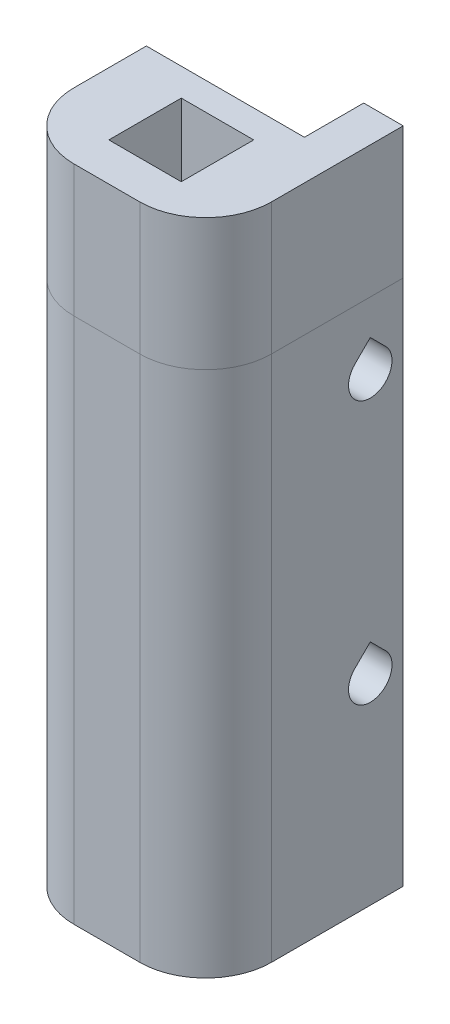
ISO-10303-21;
HEADER;
FILE_DESCRIPTION(('STEP AP214'),'2;1');
FILE_NAME('part.step','',(''),(''),'','','');
FILE_SCHEMA(('AUTOMOTIVE_DESIGN { 1 0 10303 214 1 1 1 1 }'));
ENDSEC;
DATA;
#1=APPLICATION_CONTEXT('core data for automotive mechanical design processes');
#2=APPLICATION_PROTOCOL_DEFINITION('international standard','automotive_design',2000,#1);
#3=PRODUCT_CONTEXT('',#1,'mechanical');
#4=PRODUCT('Part','Part','',(#3));
#5=PRODUCT_RELATED_PRODUCT_CATEGORY('part','',(#4));
#6=PRODUCT_DEFINITION_FORMATION('','',#4);
#7=PRODUCT_DEFINITION_CONTEXT('part definition',#1,'design');
#8=PRODUCT_DEFINITION('design','',#6,#7);
#9=PRODUCT_DEFINITION_SHAPE('','',#8);
#10=(LENGTH_UNIT() NAMED_UNIT(*) SI_UNIT(.MILLI.,.METRE.));
#11=(NAMED_UNIT(*) PLANE_ANGLE_UNIT() SI_UNIT($,.RADIAN.));
#12=(NAMED_UNIT(*) SI_UNIT($,.STERADIAN.) SOLID_ANGLE_UNIT());
#13=UNCERTAINTY_MEASURE_WITH_UNIT(LENGTH_MEASURE(1.E-05),#10,'distance_accuracy_value','');
#14=(GEOMETRIC_REPRESENTATION_CONTEXT(3) GLOBAL_UNCERTAINTY_ASSIGNED_CONTEXT((#13)) GLOBAL_UNIT_ASSIGNED_CONTEXT((#10,
#11,#12)) REPRESENTATION_CONTEXT('',''));
#15=CARTESIAN_POINT('',(0.,0.,0.));
#16=DIRECTION('',(0.,0.,1.));
#17=DIRECTION('',(1.,0.,0.));
#18=AXIS2_PLACEMENT_3D('',#15,#16,#17);
#19=CARTESIAN_POINT('',(-7.5,15.,-0.00999999999999959));
#20=DIRECTION('',(0.,-1.,0.));
#21=DIRECTION('',(0.,0.,-1.));
#22=AXIS2_PLACEMENT_3D('',#19,#20,#21);
#23=PLANE('',#22);
#24=DIRECTION('',(0.,0.,1.));
#25=VECTOR('',#24,1.);
#26=CARTESIAN_POINT('',(-7.5,15.,15.));
#27=LINE('',#26,#25);
#28=CARTESIAN_POINT('',(-7.5,15.,4.5));
#29=VERTEX_POINT('',#28);
#30=CARTESIAN_POINT('',(-7.5,15.,10.));
#31=VERTEX_POINT('',#30);
#32=EDGE_CURVE('E142',#29,#31,#27,.T.);
#33=ORIENTED_EDGE('',*,*,#32,.F.);
#34=DIRECTION('',(-1.,0.,0.));
#35=VECTOR('',#34,1.);
#36=CARTESIAN_POINT('',(0.,15.,4.5));
#37=LINE('',#36,#35);
#38=CARTESIAN_POINT('',(4.5,15.,4.5));
#39=VERTEX_POINT('',#38);
#40=EDGE_CURVE('E137',#39,#29,#37,.T.);
#41=ORIENTED_EDGE('',*,*,#40,.F.);
#42=DIRECTION('',(0.,0.,1.));
#43=VECTOR('',#42,1.);
#44=CARTESIAN_POINT('',(4.5,15.,0.));
#45=LINE('',#44,#43);
#46=CARTESIAN_POINT('',(4.5,15.,0.));
#47=VERTEX_POINT('',#46);
#48=EDGE_CURVE('E140',#47,#39,#45,.T.);
#49=ORIENTED_EDGE('',*,*,#48,.F.);
#50=DIRECTION('',(-1.,0.,0.));
#51=VECTOR('',#50,1.);
#52=CARTESIAN_POINT('',(0.,15.,0.));
#53=LINE('',#52,#51);
#54=CARTESIAN_POINT('',(7.5,15.,0.));
#55=VERTEX_POINT('',#54);
#56=EDGE_CURVE('E145',#55,#47,#53,.T.);
#57=ORIENTED_EDGE('',*,*,#56,.F.);
#58=DIRECTION('',(0.,0.,1.));
#59=VECTOR('',#58,1.);
#60=CARTESIAN_POINT('',(7.5,15.,15.));
#61=LINE('',#60,#59);
#62=CARTESIAN_POINT('',(7.5,15.,10.));
#63=VERTEX_POINT('',#62);
#64=EDGE_CURVE('E148',#55,#63,#61,.T.);
#65=ORIENTED_EDGE('',*,*,#64,.T.);
#66=CARTESIAN_POINT('',(2.5,15.,10.));
#67=DIRECTION('',(0.,-1.,0.));
#68=DIRECTION('',(0.,0.,-1.));
#69=AXIS2_PLACEMENT_3D('',#66,#67,#68);
#70=CIRCLE('',#69,5.);
#71=CARTESIAN_POINT('',(2.5,15.,15.));
#72=VERTEX_POINT('',#71);
#73=EDGE_CURVE('E129',#72,#63,#70,.F.);
#74=ORIENTED_EDGE('',*,*,#73,.F.);
#75=DIRECTION('',(-1.,0.,0.));
#76=VECTOR('',#75,1.);
#77=CARTESIAN_POINT('',(0.,15.,15.));
#78=LINE('',#77,#76);
#79=CARTESIAN_POINT('',(-2.5,15.,15.));
#80=VERTEX_POINT('',#79);
#81=EDGE_CURVE('E151',#72,#80,#78,.T.);
#82=ORIENTED_EDGE('',*,*,#81,.T.);
#83=CARTESIAN_POINT('',(-2.5,15.,10.));
#84=DIRECTION('',(0.,-1.,0.));
#85=DIRECTION('',(0.,0.,-1.));
#86=AXIS2_PLACEMENT_3D('',#83,#84,#85);
#87=CIRCLE('',#86,5.);
#88=EDGE_CURVE('E125',#31,#80,#87,.F.);
#89=ORIENTED_EDGE('',*,*,#88,.F.);
#90=EDGE_LOOP('',(#33,#41,#49,#57,#65,#74,#82,#89));
#91=FACE_BOUND('',#90,.T.);
#92=DIRECTION('',(0.,0.,-1.));
#93=VECTOR('',#92,1.);
#94=CARTESIAN_POINT('',(-2.75,15.,0.));
#95=LINE('',#94,#93);
#96=CARTESIAN_POINT('',(-2.75,15.,12.1));
#97=VERTEX_POINT('',#96);
#98=CARTESIAN_POINT('',(-2.75,15.,6.6));
#99=VERTEX_POINT('',#98);
#100=EDGE_CURVE('E134',#97,#99,#95,.T.);
#101=ORIENTED_EDGE('',*,*,#100,.F.);
#102=DIRECTION('',(-1.,0.,0.));
#103=VECTOR('',#102,1.);
#104=CARTESIAN_POINT('',(0.,15.,12.1));
#105=LINE('',#104,#103);
#106=CARTESIAN_POINT('',(2.75,15.,12.1));
#107=VERTEX_POINT('',#106);
#108=EDGE_CURVE('E132',#107,#97,#105,.T.);
#109=ORIENTED_EDGE('',*,*,#108,.F.);
#110=DIRECTION('',(0.,0.,-1.));
#111=VECTOR('',#110,1.);
#112=CARTESIAN_POINT('',(2.75,15.,0.));
#113=LINE('',#112,#111);
#114=CARTESIAN_POINT('',(2.75,15.,6.6));
#115=VERTEX_POINT('',#114);
#116=EDGE_CURVE('E102',#107,#115,#113,.T.);
#117=ORIENTED_EDGE('',*,*,#116,.T.);
#118=DIRECTION('',(-1.,0.,0.));
#119=VECTOR('',#118,1.);
#120=CARTESIAN_POINT('',(0.,15.,6.6));
#121=LINE('',#120,#119);
#122=EDGE_CURVE('E154',#115,#99,#121,.T.);
#123=ORIENTED_EDGE('',*,*,#122,.T.);
#124=EDGE_LOOP('',(#101,#109,#117,#123));
#125=FACE_BOUND('',#124,.T.);
#126=ADVANCED_FACE('F55',(#91,#125),#23,.T.);
#127=CARTESIAN_POINT('',(0.,0.,0.));
#128=DIRECTION('',(0.,0.,-1.));
#129=DIRECTION('',(-1.,0.,0.));
#130=AXIS2_PLACEMENT_3D('',#127,#128,#129);
#131=PLANE('',#130);
#132=DIRECTION('',(0.,1.,0.));
#133=VECTOR('',#132,1.);
#134=CARTESIAN_POINT('',(7.5,-25.,0.));
#135=LINE('',#134,#133);
#136=CARTESIAN_POINT('',(7.5,25.,0.));
#137=VERTEX_POINT('',#136);
#138=EDGE_CURVE('E173',#55,#137,#135,.T.);
#139=ORIENTED_EDGE('',*,*,#138,.F.);
#140=ORIENTED_EDGE('',*,*,#56,.T.);
#141=DIRECTION('',(0.,1.,0.));
#142=VECTOR('',#141,1.);
#143=CARTESIAN_POINT('',(4.5,-25.,0.));
#144=LINE('',#143,#142);
#145=CARTESIAN_POINT('',(4.5,25.,0.));
#146=VERTEX_POINT('',#145);
#147=EDGE_CURVE('E124',#47,#146,#144,.T.);
#148=ORIENTED_EDGE('',*,*,#147,.T.);
#149=DIRECTION('',(-1.,0.,0.));
#150=VECTOR('',#149,1.);
#151=CARTESIAN_POINT('',(7.5,25.,0.));
#152=LINE('',#151,#150);
#153=EDGE_CURVE('E176',#137,#146,#152,.T.);
#154=ORIENTED_EDGE('',*,*,#153,.F.);
#155=EDGE_LOOP('',(#139,#140,#148,#154));
#156=FACE_BOUND('',#155,.T.);
#157=ADVANCED_FACE('F236',(#156),#131,.T.);
#158=CARTESIAN_POINT('',(4.5,-25.,0.));
#159=DIRECTION('',(-1.,0.,0.));
#160=DIRECTION('',(0.,0.,1.));
#161=AXIS2_PLACEMENT_3D('',#158,#159,#160);
#162=PLANE('',#161);
#163=ORIENTED_EDGE('',*,*,#147,.F.);
#164=ORIENTED_EDGE('',*,*,#48,.T.);
#165=DIRECTION('',(0.,1.,0.));
#166=VECTOR('',#165,1.);
#167=CARTESIAN_POINT('',(4.5,-25.,4.5));
#168=LINE('',#167,#166);
#169=CARTESIAN_POINT('',(4.5,25.,4.5));
#170=VERTEX_POINT('',#169);
#171=EDGE_CURVE('E59',#39,#170,#168,.T.);
#172=ORIENTED_EDGE('',*,*,#171,.T.);
#173=DIRECTION('',(0.,0.,1.));
#174=VECTOR('',#173,1.);
#175=CARTESIAN_POINT('',(4.5,25.,0.));
#176=LINE('',#175,#174);
#177=EDGE_CURVE('E65',#146,#170,#176,.T.);
#178=ORIENTED_EDGE('',*,*,#177,.F.);
#179=EDGE_LOOP('',(#163,#164,#172,#178));
#180=FACE_BOUND('',#179,.T.);
#181=ADVANCED_FACE('F238',(#180),#162,.T.);
#182=CARTESIAN_POINT('',(0.,-25.,4.5));
#183=DIRECTION('',(0.,0.,-1.));
#184=DIRECTION('',(-1.,0.,0.));
#185=AXIS2_PLACEMENT_3D('',#182,#183,#184);
#186=PLANE('',#185);
#187=ORIENTED_EDGE('',*,*,#171,.F.);
#188=ORIENTED_EDGE('',*,*,#40,.T.);
#189=DIRECTION('',(0.,1.,0.));
#190=VECTOR('',#189,1.);
#191=CARTESIAN_POINT('',(-7.5,-25.,4.5));
#192=LINE('',#191,#190);
#193=CARTESIAN_POINT('',(-7.5,25.,4.5));
#194=VERTEX_POINT('',#193);
#195=EDGE_CURVE('E158',#29,#194,#192,.T.);
#196=ORIENTED_EDGE('',*,*,#195,.T.);
#197=DIRECTION('',(-1.,0.,0.));
#198=VECTOR('',#197,1.);
#199=CARTESIAN_POINT('',(0.,25.,4.5));
#200=LINE('',#199,#198);
#201=EDGE_CURVE('E12',#170,#194,#200,.T.);
#202=ORIENTED_EDGE('',*,*,#201,.F.);
#203=EDGE_LOOP('',(#187,#188,#196,#202));
#204=FACE_BOUND('',#203,.T.);
#205=ADVANCED_FACE('F205',(#204),#186,.T.);
#206=CARTESIAN_POINT('',(0.,-25.,6.6));
#207=DIRECTION('',(0.,0.,-1.));
#208=DIRECTION('',(-1.,0.,0.));
#209=AXIS2_PLACEMENT_3D('',#206,#207,#208);
#210=PLANE('',#209);
#211=ORIENTED_EDGE('',*,*,#122,.F.);
#212=DIRECTION('',(0.,1.,0.));
#213=VECTOR('',#212,1.);
#214=CARTESIAN_POINT('',(2.75,-25.,6.6));
#215=LINE('',#214,#213);
#216=CARTESIAN_POINT('',(2.75,25.,6.6));
#217=VERTEX_POINT('',#216);
#218=EDGE_CURVE('E88',#115,#217,#215,.T.);
#219=ORIENTED_EDGE('',*,*,#218,.T.);
#220=DIRECTION('',(-1.,0.,0.));
#221=VECTOR('',#220,1.);
#222=CARTESIAN_POINT('',(0.,25.,6.6));
#223=LINE('',#222,#221);
#224=CARTESIAN_POINT('',(-2.75,25.,6.6));
#225=VERTEX_POINT('',#224);
#226=EDGE_CURVE('E119',#217,#225,#223,.T.);
#227=ORIENTED_EDGE('',*,*,#226,.T.);
#228=DIRECTION('',(0.,1.,0.));
#229=VECTOR('',#228,1.);
#230=CARTESIAN_POINT('',(-2.75,-25.,6.6));
#231=LINE('',#230,#229);
#232=EDGE_CURVE('E178',#99,#225,#231,.T.);
#233=ORIENTED_EDGE('',*,*,#232,.F.);
#234=EDGE_LOOP('',(#211,#219,#227,#233));
#235=FACE_BOUND('',#234,.T.);
#236=ADVANCED_FACE('F251',(#235),#210,.F.);
#237=CARTESIAN_POINT('',(7.5,-25.,15.));
#238=DIRECTION('',(-1.,0.,0.));
#239=DIRECTION('',(0.,0.,1.));
#240=AXIS2_PLACEMENT_3D('',#237,#238,#239);
#241=PLANE('',#240);
#242=ORIENTED_EDGE('',*,*,#64,.F.);
#243=ORIENTED_EDGE('',*,*,#138,.T.);
#244=DIRECTION('',(0.,0.,-1.));
#245=VECTOR('',#244,1.);
#246=CARTESIAN_POINT('',(7.5,25.,15.));
#247=LINE('',#246,#245);
#248=CARTESIAN_POINT('',(7.5,25.,10.));
#249=VERTEX_POINT('',#248);
#250=EDGE_CURVE('E172',#249,#137,#247,.T.);
#251=ORIENTED_EDGE('',*,*,#250,.F.);
#252=DIRECTION('',(0.,1.,0.));
#253=VECTOR('',#252,1.);
#254=CARTESIAN_POINT('',(7.5,-25.,10.));
#255=LINE('',#254,#253);
#256=EDGE_CURVE('E161',#249,#63,#255,.F.);
#257=ORIENTED_EDGE('',*,*,#256,.T.);
#258=EDGE_LOOP('',(#242,#243,#251,#257));
#259=FACE_BOUND('',#258,.T.);
#260=ADVANCED_FACE('F231',(#259),#241,.F.);
#261=CARTESIAN_POINT('',(7.5,25.,15.));
#262=DIRECTION('',(0.,-1.,0.));
#263=DIRECTION('',(0.,0.,-1.));
#264=AXIS2_PLACEMENT_3D('',#261,#262,#263);
#265=PLANE('',#264);
#266=ORIENTED_EDGE('',*,*,#201,.T.);
#267=DIRECTION('',(0.,0.,-1.));
#268=VECTOR('',#267,1.);
#269=CARTESIAN_POINT('',(-7.5,25.,15.));
#270=LINE('',#269,#268);
#271=CARTESIAN_POINT('',(-7.5,25.,10.));
#272=VERTEX_POINT('',#271);
#273=EDGE_CURVE('E191',#272,#194,#270,.T.);
#274=ORIENTED_EDGE('',*,*,#273,.F.);
#275=CARTESIAN_POINT('',(-2.5,25.,10.));
#276=DIRECTION('',(0.,-1.,0.));
#277=DIRECTION('',(0.,0.,-1.));
#278=AXIS2_PLACEMENT_3D('',#275,#276,#277);
#279=CIRCLE('',#278,5.);
#280=CARTESIAN_POINT('',(-2.5,25.,15.));
#281=VERTEX_POINT('',#280);
#282=EDGE_CURVE('E169',#272,#281,#279,.F.);
#283=ORIENTED_EDGE('',*,*,#282,.T.);
#284=DIRECTION('',(-1.,0.,0.));
#285=VECTOR('',#284,1.);
#286=CARTESIAN_POINT('',(7.5,25.,15.));
#287=LINE('',#286,#285);
#288=CARTESIAN_POINT('',(2.5,25.,15.));
#289=VERTEX_POINT('',#288);
#290=EDGE_CURVE('E177',#289,#281,#287,.T.);
#291=ORIENTED_EDGE('',*,*,#290,.F.);
#292=CARTESIAN_POINT('',(2.5,25.,10.));
#293=DIRECTION('',(0.,-1.,0.));
#294=DIRECTION('',(0.,0.,-1.));
#295=AXIS2_PLACEMENT_3D('',#292,#293,#294);
#296=CIRCLE('',#295,5.);
#297=EDGE_CURVE('E164',#289,#249,#296,.F.);
#298=ORIENTED_EDGE('',*,*,#297,.T.);
#299=ORIENTED_EDGE('',*,*,#250,.T.);
#300=ORIENTED_EDGE('',*,*,#153,.T.);
#301=ORIENTED_EDGE('',*,*,#177,.T.);
#302=EDGE_LOOP('',(#266,#274,#283,#291,#298,#299,#300,#301));
#303=FACE_BOUND('',#302,.T.);
#304=DIRECTION('',(0.,0.,-1.));
#305=VECTOR('',#304,1.);
#306=CARTESIAN_POINT('',(-2.75,25.,0.));
#307=LINE('',#306,#305);
#308=CARTESIAN_POINT('',(-2.75,25.,12.1));
#309=VERTEX_POINT('',#308);
#310=EDGE_CURVE('E116',#309,#225,#307,.T.);
#311=ORIENTED_EDGE('',*,*,#310,.T.);
#312=ORIENTED_EDGE('',*,*,#226,.F.);
#313=DIRECTION('',(0.,0.,-1.));
#314=VECTOR('',#313,1.);
#315=CARTESIAN_POINT('',(2.75,25.,0.));
#316=LINE('',#315,#314);
#317=CARTESIAN_POINT('',(2.75,25.,12.1));
#318=VERTEX_POINT('',#317);
#319=EDGE_CURVE('E98',#318,#217,#316,.T.);
#320=ORIENTED_EDGE('',*,*,#319,.F.);
#321=DIRECTION('',(-1.,0.,0.));
#322=VECTOR('',#321,1.);
#323=CARTESIAN_POINT('',(0.,25.,12.1));
#324=LINE('',#323,#322);
#325=EDGE_CURVE('E109',#318,#309,#324,.T.);
#326=ORIENTED_EDGE('',*,*,#325,.T.);
#327=EDGE_LOOP('',(#311,#312,#320,#326));
#328=FACE_BOUND('',#327,.T.);
#329=ADVANCED_FACE('F118',(#303,#328),#265,.F.);
#330=CARTESIAN_POINT('',(0.,0.,15.));
#331=DIRECTION('',(0.,0.,-1.));
#332=DIRECTION('',(-1.,0.,0.));
#333=AXIS2_PLACEMENT_3D('',#330,#331,#332);
#334=PLANE('',#333);
#335=ORIENTED_EDGE('',*,*,#81,.F.);
#336=DIRECTION('',(0.,1.,0.));
#337=VECTOR('',#336,1.);
#338=CARTESIAN_POINT('',(2.5,0.,15.));
#339=LINE('',#338,#337);
#340=EDGE_CURVE('E165',#72,#289,#339,.T.);
#341=ORIENTED_EDGE('',*,*,#340,.T.);
#342=ORIENTED_EDGE('',*,*,#290,.T.);
#343=DIRECTION('',(0.,1.,0.));
#344=VECTOR('',#343,1.);
#345=CARTESIAN_POINT('',(-2.5,-25.,15.));
#346=LINE('',#345,#344);
#347=EDGE_CURVE('E168',#281,#80,#346,.F.);
#348=ORIENTED_EDGE('',*,*,#347,.T.);
#349=EDGE_LOOP('',(#335,#341,#342,#348));
#350=FACE_BOUND('',#349,.T.);
#351=ADVANCED_FACE('F254',(#350),#334,.F.);
#352=CARTESIAN_POINT('',(-7.5,-25.,15.));
#353=DIRECTION('',(-1.,0.,0.));
#354=DIRECTION('',(0.,0.,1.));
#355=AXIS2_PLACEMENT_3D('',#352,#353,#354);
#356=PLANE('',#355);
#357=ORIENTED_EDGE('',*,*,#195,.F.);
#358=ORIENTED_EDGE('',*,*,#32,.T.);
#359=DIRECTION('',(0.,1.,0.));
#360=VECTOR('',#359,1.);
#361=CARTESIAN_POINT('',(-7.5,25.,10.));
#362=LINE('',#361,#360);
#363=EDGE_CURVE('E128',#31,#272,#362,.T.);
#364=ORIENTED_EDGE('',*,*,#363,.T.);
#365=ORIENTED_EDGE('',*,*,#273,.T.);
#366=EDGE_LOOP('',(#357,#358,#364,#365));
#367=FACE_BOUND('',#366,.T.);
#368=ADVANCED_FACE('F212',(#367),#356,.T.);
#369=CARTESIAN_POINT('',(-2.5,-25.,10.));
#370=DIRECTION('',(0.,-1.,0.));
#371=DIRECTION('',(0.,0.,-1.));
#372=AXIS2_PLACEMENT_3D('',#369,#370,#371);
#373=CYLINDRICAL_SURFACE('',#372,5.);
#374=ORIENTED_EDGE('',*,*,#363,.F.);
#375=ORIENTED_EDGE('',*,*,#88,.T.);
#376=ORIENTED_EDGE('',*,*,#347,.F.);
#377=ORIENTED_EDGE('',*,*,#282,.F.);
#378=EDGE_LOOP('',(#374,#375,#376,#377));
#379=FACE_BOUND('',#378,.T.);
#380=ADVANCED_FACE('F57',(#379),#373,.T.);
#381=CARTESIAN_POINT('',(2.5,0.,10.));
#382=DIRECTION('',(0.,1.,0.));
#383=DIRECTION('',(0.,0.,1.));
#384=AXIS2_PLACEMENT_3D('',#381,#382,#383);
#385=CYLINDRICAL_SURFACE('',#384,5.);
#386=ORIENTED_EDGE('',*,*,#340,.F.);
#387=ORIENTED_EDGE('',*,*,#73,.T.);
#388=ORIENTED_EDGE('',*,*,#256,.F.);
#389=ORIENTED_EDGE('',*,*,#297,.F.);
#390=EDGE_LOOP('',(#386,#387,#388,#389));
#391=FACE_BOUND('',#390,.T.);
#392=ADVANCED_FACE('F263',(#391),#385,.T.);
#393=CARTESIAN_POINT('',(-2.75,-25.,0.));
#394=DIRECTION('',(1.,0.,0.));
#395=DIRECTION('',(0.,0.,-1.));
#396=AXIS2_PLACEMENT_3D('',#393,#394,#395);
#397=PLANE('',#396);
#398=DIRECTION('',(0.,1.,0.));
#399=VECTOR('',#398,1.);
#400=CARTESIAN_POINT('',(-2.75,-25.,12.1));
#401=LINE('',#400,#399);
#402=EDGE_CURVE('E105',#97,#309,#401,.T.);
#403=ORIENTED_EDGE('',*,*,#402,.F.);
#404=ORIENTED_EDGE('',*,*,#100,.T.);
#405=ORIENTED_EDGE('',*,*,#232,.T.);
#406=ORIENTED_EDGE('',*,*,#310,.F.);
#407=EDGE_LOOP('',(#403,#404,#405,#406));
#408=FACE_BOUND('',#407,.T.);
#409=ADVANCED_FACE('F260',(#408),#397,.T.);
#410=CARTESIAN_POINT('',(2.75,-25.,0.));
#411=DIRECTION('',(1.,0.,0.));
#412=DIRECTION('',(0.,0.,-1.));
#413=AXIS2_PLACEMENT_3D('',#410,#411,#412);
#414=PLANE('',#413);
#415=ORIENTED_EDGE('',*,*,#116,.F.);
#416=DIRECTION('',(0.,1.,0.));
#417=VECTOR('',#416,1.);
#418=CARTESIAN_POINT('',(2.75,-25.,12.1));
#419=LINE('',#418,#417);
#420=EDGE_CURVE('E94',#107,#318,#419,.T.);
#421=ORIENTED_EDGE('',*,*,#420,.T.);
#422=ORIENTED_EDGE('',*,*,#319,.T.);
#423=ORIENTED_EDGE('',*,*,#218,.F.);
#424=EDGE_LOOP('',(#415,#421,#422,#423));
#425=FACE_BOUND('',#424,.T.);
#426=ADVANCED_FACE('F96',(#425),#414,.F.);
#427=CARTESIAN_POINT('',(0.,-25.,12.1));
#428=DIRECTION('',(0.,0.,-1.));
#429=DIRECTION('',(-1.,0.,0.));
#430=AXIS2_PLACEMENT_3D('',#427,#428,#429);
#431=PLANE('',#430);
#432=ORIENTED_EDGE('',*,*,#420,.F.);
#433=ORIENTED_EDGE('',*,*,#108,.T.);
#434=ORIENTED_EDGE('',*,*,#402,.T.);
#435=ORIENTED_EDGE('',*,*,#325,.F.);
#436=EDGE_LOOP('',(#432,#433,#434,#435));
#437=FACE_BOUND('',#436,.T.);
#438=ADVANCED_FACE('F110',(#437),#431,.T.);
#439=CLOSED_SHELL('',(#126,#157,#181,#205,#236,#260,#329,#351,#368,#380,#392,#409,#426,#438));
#440=MANIFOLD_SOLID_BREP('B2',#439);
#441=CARTESIAN_POINT('',(-7.5,15.,-0.00999999999999959));
#442=DIRECTION('',(0.,-1.,0.));
#443=DIRECTION('',(0.,0.,-1.));
#444=AXIS2_PLACEMENT_3D('',#441,#442,#443);
#445=PLANE('',#444);
#446=DIRECTION('',(-1.,0.,0.));
#447=VECTOR('',#446,1.);
#448=CARTESIAN_POINT('',(0.,15.,4.5));
#449=LINE('',#448,#447);
#450=CARTESIAN_POINT('',(4.5,15.,4.5));
#451=VERTEX_POINT('',#450);
#452=CARTESIAN_POINT('',(-7.5,15.,4.5));
#453=VERTEX_POINT('',#452);
#454=EDGE_CURVE('E597',#451,#453,#449,.T.);
#455=ORIENTED_EDGE('',*,*,#454,.T.);
#456=DIRECTION('',(0.,0.,1.));
#457=VECTOR('',#456,1.);
#458=CARTESIAN_POINT('',(-7.5,15.,15.));
#459=LINE('',#458,#457);
#460=CARTESIAN_POINT('',(-7.5,15.,10.));
#461=VERTEX_POINT('',#460);
#462=EDGE_CURVE('E413',#453,#461,#459,.T.);
#463=ORIENTED_EDGE('',*,*,#462,.T.);
#464=CARTESIAN_POINT('',(-2.5,15.,10.));
#465=DIRECTION('',(0.,-1.,0.));
#466=DIRECTION('',(0.,0.,-1.));
#467=AXIS2_PLACEMENT_3D('',#464,#465,#466);
#468=CIRCLE('',#467,5.);
#469=CARTESIAN_POINT('',(-2.5,15.,15.));
#470=VERTEX_POINT('',#469);
#471=EDGE_CURVE('E53',#461,#470,#468,.F.);
#472=ORIENTED_EDGE('',*,*,#471,.T.);
#473=DIRECTION('',(-1.,0.,0.));
#474=VECTOR('',#473,1.);
#475=CARTESIAN_POINT('',(0.,15.,15.));
#476=LINE('',#475,#474);
#477=CARTESIAN_POINT('',(2.5,15.,15.));
#478=VERTEX_POINT('',#477);
#479=EDGE_CURVE('E407',#478,#470,#476,.T.);
#480=ORIENTED_EDGE('',*,*,#479,.F.);
#481=CARTESIAN_POINT('',(2.5,15.,10.));
#482=DIRECTION('',(0.,-1.,0.));
#483=DIRECTION('',(0.,0.,-1.));
#484=AXIS2_PLACEMENT_3D('',#481,#482,#483);
#485=CIRCLE('',#484,5.);
#486=CARTESIAN_POINT('',(7.5,15.,10.));
#487=VERTEX_POINT('',#486);
#488=EDGE_CURVE('E399',#478,#487,#485,.F.);
#489=ORIENTED_EDGE('',*,*,#488,.T.);
#490=DIRECTION('',(0.,0.,1.));
#491=VECTOR('',#490,1.);
#492=CARTESIAN_POINT('',(7.5,15.,15.));
#493=LINE('',#492,#491);
#494=CARTESIAN_POINT('',(7.5,15.,0.));
#495=VERTEX_POINT('',#494);
#496=EDGE_CURVE('E576',#495,#487,#493,.T.);
#497=ORIENTED_EDGE('',*,*,#496,.F.);
#498=DIRECTION('',(-1.,0.,0.));
#499=VECTOR('',#498,1.);
#500=CARTESIAN_POINT('',(0.,15.,0.));
#501=LINE('',#500,#499);
#502=CARTESIAN_POINT('',(4.5,15.,0.));
#503=VERTEX_POINT('',#502);
#504=EDGE_CURVE('E393',#495,#503,#501,.T.);
#505=ORIENTED_EDGE('',*,*,#504,.T.);
#506=DIRECTION('',(0.,0.,1.));
#507=VECTOR('',#506,1.);
#508=CARTESIAN_POINT('',(4.5,15.,0.));
#509=LINE('',#508,#507);
#510=EDGE_CURVE('E580',#503,#451,#509,.T.);
#511=ORIENTED_EDGE('',*,*,#510,.T.);
#512=EDGE_LOOP('',(#455,#463,#472,#480,#489,#497,#505,#511));
#513=FACE_BOUND('',#512,.T.);
#514=DIRECTION('',(0.,0.,-1.));
#515=VECTOR('',#514,1.);
#516=CARTESIAN_POINT('',(-2.75,15.,0.));
#517=LINE('',#516,#515);
#518=CARTESIAN_POINT('',(-2.75,15.,12.1));
#519=VERTEX_POINT('',#518);
#520=CARTESIAN_POINT('',(-2.75,15.,6.6));
#521=VERTEX_POINT('',#520);
#522=EDGE_CURVE('E589',#519,#521,#517,.T.);
#523=ORIENTED_EDGE('',*,*,#522,.T.);
#524=DIRECTION('',(-1.,0.,0.));
#525=VECTOR('',#524,1.);
#526=CARTESIAN_POINT('',(0.,15.,6.6));
#527=LINE('',#526,#525);
#528=CARTESIAN_POINT('',(2.75,15.,6.6));
#529=VERTEX_POINT('',#528);
#530=EDGE_CURVE('E577',#529,#521,#527,.T.);
#531=ORIENTED_EDGE('',*,*,#530,.F.);
#532=DIRECTION('',(0.,0.,-1.));
#533=VECTOR('',#532,1.);
#534=CARTESIAN_POINT('',(2.75,15.,0.));
#535=LINE('',#534,#533);
#536=CARTESIAN_POINT('',(2.75,15.,12.1));
#537=VERTEX_POINT('',#536);
#538=EDGE_CURVE('E572',#537,#529,#535,.T.);
#539=ORIENTED_EDGE('',*,*,#538,.F.);
#540=DIRECTION('',(-1.,0.,0.));
#541=VECTOR('',#540,1.);
#542=CARTESIAN_POINT('',(0.,15.,12.1));
#543=LINE('',#542,#541);
#544=EDGE_CURVE('E586',#537,#519,#543,.T.);
#545=ORIENTED_EDGE('',*,*,#544,.T.);
#546=EDGE_LOOP('',(#523,#531,#539,#545));
#547=FACE_BOUND('',#546,.T.);
#548=ADVANCED_FACE('F390',(#513,#547),#445,.F.);
#549=CARTESIAN_POINT('',(7.5,-25.,15.));
#550=DIRECTION('',(0.,-1.,0.));
#551=DIRECTION('',(0.,0.,-1.));
#552=AXIS2_PLACEMENT_3D('',#549,#550,#551);
#553=PLANE('',#552);
#554=DIRECTION('',(0.,0.,-1.));
#555=VECTOR('',#554,1.);
#556=CARTESIAN_POINT('',(-7.5,-25.,15.));
#557=LINE('',#556,#555);
#558=CARTESIAN_POINT('',(-7.5,-25.,10.));
#559=VERTEX_POINT('',#558);
#560=CARTESIAN_POINT('',(-7.5,-25.,4.5));
#561=VERTEX_POINT('',#560);
#562=EDGE_CURVE('E535',#559,#561,#557,.T.);
#563=ORIENTED_EDGE('',*,*,#562,.T.);
#564=DIRECTION('',(-1.,0.,0.));
#565=VECTOR('',#564,1.);
#566=CARTESIAN_POINT('',(0.,-25.,4.5));
#567=LINE('',#566,#565);
#568=CARTESIAN_POINT('',(4.5,-25.,4.5));
#569=VERTEX_POINT('',#568);
#570=EDGE_CURVE('E518',#569,#561,#567,.T.);
#571=ORIENTED_EDGE('',*,*,#570,.F.);
#572=DIRECTION('',(0.,0.,1.));
#573=VECTOR('',#572,1.);
#574=CARTESIAN_POINT('',(4.5,-25.,0.));
#575=LINE('',#574,#573);
#576=CARTESIAN_POINT('',(4.5,-25.,0.));
#577=VERTEX_POINT('',#576);
#578=EDGE_CURVE('E528',#577,#569,#575,.T.);
#579=ORIENTED_EDGE('',*,*,#578,.F.);
#580=DIRECTION('',(-1.,0.,0.));
#581=VECTOR('',#580,1.);
#582=CARTESIAN_POINT('',(7.5,-25.,0.));
#583=LINE('',#582,#581);
#584=CARTESIAN_POINT('',(7.5,-25.,0.));
#585=VERTEX_POINT('',#584);
#586=EDGE_CURVE('E617',#585,#577,#583,.T.);
#587=ORIENTED_EDGE('',*,*,#586,.F.);
#588=DIRECTION('',(0.,0.,-1.));
#589=VECTOR('',#588,1.);
#590=CARTESIAN_POINT('',(7.5,-25.,15.));
#591=LINE('',#590,#589);
#592=CARTESIAN_POINT('',(7.5,-25.,10.));
#593=VERTEX_POINT('',#592);
#594=EDGE_CURVE('E546',#593,#585,#591,.T.);
#595=ORIENTED_EDGE('',*,*,#594,.F.);
#596=CARTESIAN_POINT('',(2.5,-25.,10.));
#597=DIRECTION('',(0.,-1.,0.));
#598=DIRECTION('',(0.,0.,-1.));
#599=AXIS2_PLACEMENT_3D('',#596,#597,#598);
#600=CIRCLE('',#599,5.);
#601=CARTESIAN_POINT('',(2.5,-25.,15.));
#602=VERTEX_POINT('',#601);
#603=EDGE_CURVE('E567',#593,#602,#600,.T.);
#604=ORIENTED_EDGE('',*,*,#603,.T.);
#605=DIRECTION('',(-1.,0.,0.));
#606=VECTOR('',#605,1.);
#607=CARTESIAN_POINT('',(7.5,-25.,15.));
#608=LINE('',#607,#606);
#609=CARTESIAN_POINT('',(-2.5,-25.,15.));
#610=VERTEX_POINT('',#609);
#611=EDGE_CURVE('E547',#602,#610,#608,.T.);
#612=ORIENTED_EDGE('',*,*,#611,.T.);
#613=CARTESIAN_POINT('',(-2.5,-25.,10.));
#614=DIRECTION('',(0.,-1.,0.));
#615=DIRECTION('',(0.,0.,-1.));
#616=AXIS2_PLACEMENT_3D('',#613,#614,#615);
#617=CIRCLE('',#616,5.);
#618=EDGE_CURVE('E544',#610,#559,#617,.T.);
#619=ORIENTED_EDGE('',*,*,#618,.T.);
#620=EDGE_LOOP('',(#563,#571,#579,#587,#595,#604,#612,#619));
#621=FACE_BOUND('',#620,.T.);
#622=DIRECTION('',(-1.,0.,0.));
#623=VECTOR('',#622,1.);
#624=CARTESIAN_POINT('',(0.,-25.,6.6));
#625=LINE('',#624,#623);
#626=CARTESIAN_POINT('',(2.75,-25.,6.6));
#627=VERTEX_POINT('',#626);
#628=CARTESIAN_POINT('',(-2.75,-25.,6.6));
#629=VERTEX_POINT('',#628);
#630=EDGE_CURVE('E742',#627,#629,#625,.T.);
#631=ORIENTED_EDGE('',*,*,#630,.T.);
#632=DIRECTION('',(0.,0.,-1.));
#633=VECTOR('',#632,1.);
#634=CARTESIAN_POINT('',(-2.75,-25.,0.));
#635=LINE('',#634,#633);
#636=CARTESIAN_POINT('',(-2.75,-25.,12.1));
#637=VERTEX_POINT('',#636);
#638=EDGE_CURVE('E613',#637,#629,#635,.T.);
#639=ORIENTED_EDGE('',*,*,#638,.F.);
#640=DIRECTION('',(-1.,0.,0.));
#641=VECTOR('',#640,1.);
#642=CARTESIAN_POINT('',(0.,-25.,12.1));
#643=LINE('',#642,#641);
#644=CARTESIAN_POINT('',(2.75,-25.,12.1));
#645=VERTEX_POINT('',#644);
#646=EDGE_CURVE('E735',#645,#637,#643,.T.);
#647=ORIENTED_EDGE('',*,*,#646,.F.);
#648=DIRECTION('',(0.,0.,-1.));
#649=VECTOR('',#648,1.);
#650=CARTESIAN_POINT('',(2.75,-25.,0.));
#651=LINE('',#650,#649);
#652=EDGE_CURVE('E738',#645,#627,#651,.T.);
#653=ORIENTED_EDGE('',*,*,#652,.T.);
#654=EDGE_LOOP('',(#631,#639,#647,#653));
#655=FACE_BOUND('',#654,.T.);
#656=ADVANCED_FACE('F540',(#621,#655),#553,.T.);
#657=CARTESIAN_POINT('',(0.,0.,0.));
#658=DIRECTION('',(0.,0.,-1.));
#659=DIRECTION('',(-1.,0.,0.));
#660=AXIS2_PLACEMENT_3D('',#657,#658,#659);
#661=PLANE('',#660);
#662=ORIENTED_EDGE('',*,*,#504,.F.);
#663=DIRECTION('',(0.,1.,0.));
#664=VECTOR('',#663,1.);
#665=CARTESIAN_POINT('',(7.5,-25.,0.));
#666=LINE('',#665,#664);
#667=EDGE_CURVE('E553',#585,#495,#666,.T.);
#668=ORIENTED_EDGE('',*,*,#667,.F.);
#669=ORIENTED_EDGE('',*,*,#586,.T.);
#670=DIRECTION('',(0.,1.,0.));
#671=VECTOR('',#670,1.);
#672=CARTESIAN_POINT('',(4.5,-25.,0.));
#673=LINE('',#672,#671);
#674=EDGE_CURVE('E609',#577,#503,#673,.T.);
#675=ORIENTED_EDGE('',*,*,#674,.T.);
#676=EDGE_LOOP('',(#662,#668,#669,#675));
#677=FACE_BOUND('',#676,.T.);
#678=ADVANCED_FACE('F629',(#677),#661,.T.);
#679=CARTESIAN_POINT('',(7.5,-25.,15.));
#680=DIRECTION('',(-1.,0.,0.));
#681=DIRECTION('',(0.,0.,1.));
#682=AXIS2_PLACEMENT_3D('',#679,#680,#681);
#683=PLANE('',#682);
#684=DIRECTION('',(0.,0.707106781186552,0.707106781186543));
#685=VECTOR('',#684,1.);
#686=CARTESIAN_POINT('',(7.5,-7.67773232803989,2.5));
#687=LINE('',#686,#685);
#688=CARTESIAN_POINT('',(7.5,-8.72476877166464,1.45296355637526));
#689=VERTEX_POINT('',#688);
#690=CARTESIAN_POINT('',(7.5,-7.67773232803989,2.5));
#691=VERTEX_POINT('',#690);
#692=EDGE_CURVE('E779',#689,#691,#687,.T.);
#693=ORIENTED_EDGE('',*,*,#692,.F.);
#694=CARTESIAN_POINT('',(7.5,-9.99999999999998,2.5));
#695=DIRECTION('',(1.,0.,0.));
#696=DIRECTION('',(0.,0.,-1.));
#697=AXIS2_PLACEMENT_3D('',#694,#695,#696);
#698=CIRCLE('',#697,1.65);
#699=CARTESIAN_POINT('',(7.5,-8.72476877166465,3.54703644362474));
#700=VERTEX_POINT('',#699);
#701=EDGE_CURVE('E771',#700,#689,#698,.T.);
#702=ORIENTED_EDGE('',*,*,#701,.F.);
#703=DIRECTION('',(0.,-0.707106781186552,0.707106781186543));
#704=VECTOR('',#703,1.);
#705=CARTESIAN_POINT('',(7.5,-7.67773232803989,2.5));
#706=LINE('',#705,#704);
#707=EDGE_CURVE('E774',#691,#700,#706,.T.);
#708=ORIENTED_EDGE('',*,*,#707,.F.);
#709=EDGE_LOOP('',(#693,#702,#708));
#710=FACE_BOUND('',#709,.T.);
#711=DIRECTION('',(0.,0.707106781186546,0.707106781186549));
#712=VECTOR('',#711,1.);
#713=CARTESIAN_POINT('',(7.5,11.1667261889578,1.3332738110422));
#714=LINE('',#713,#712);
#715=CARTESIAN_POINT('',(7.5,11.1667261889578,1.3332738110422));
#716=VERTEX_POINT('',#715);
#717=CARTESIAN_POINT('',(7.5,12.3334523779156,2.5));
#718=VERTEX_POINT('',#717);
#719=EDGE_CURVE('E796',#716,#718,#714,.T.);
#720=ORIENTED_EDGE('',*,*,#719,.F.);
#721=CARTESIAN_POINT('',(7.5,9.99999999999998,2.5));
#722=DIRECTION('',(1.,0.,0.));
#723=DIRECTION('',(0.,0.,1.));
#724=AXIS2_PLACEMENT_3D('',#721,#722,#723);
#725=CIRCLE('',#724,1.65);
#726=CARTESIAN_POINT('',(7.5,11.1667261889578,3.6667261889578));
#727=VERTEX_POINT('',#726);
#728=EDGE_CURVE('E800',#727,#716,#725,.T.);
#729=ORIENTED_EDGE('',*,*,#728,.F.);
#730=DIRECTION('',(0.,-0.707106781186547,0.707106781186548));
#731=VECTOR('',#730,1.);
#732=CARTESIAN_POINT('',(7.5,11.1667261889578,3.6667261889578));
#733=LINE('',#732,#731);
#734=EDGE_CURVE('E787',#718,#727,#733,.T.);
#735=ORIENTED_EDGE('',*,*,#734,.F.);
#736=EDGE_LOOP('',(#720,#729,#735));
#737=FACE_BOUND('',#736,.T.);
#738=ORIENTED_EDGE('',*,*,#667,.T.);
#739=ORIENTED_EDGE('',*,*,#496,.T.);
#740=DIRECTION('',(0.,1.,0.));
#741=VECTOR('',#740,1.);
#742=CARTESIAN_POINT('',(7.5,-25.,10.));
#743=LINE('',#742,#741);
#744=EDGE_CURVE('E562',#487,#593,#743,.F.);
#745=ORIENTED_EDGE('',*,*,#744,.T.);
#746=ORIENTED_EDGE('',*,*,#594,.T.);
#747=EDGE_LOOP('',(#738,#739,#745,#746));
#748=FACE_BOUND('',#747,.T.);
#749=ADVANCED_FACE('F625',(#710,#737,#748),#683,.F.);
#750=CARTESIAN_POINT('',(-7.5,-25.,15.));
#751=DIRECTION('',(-1.,0.,0.));
#752=DIRECTION('',(0.,0.,1.));
#753=AXIS2_PLACEMENT_3D('',#750,#751,#752);
#754=PLANE('',#753);
#755=DIRECTION('',(0.,1.,0.));
#756=VECTOR('',#755,1.);
#757=CARTESIAN_POINT('',(-7.5,-25.,4.5));
#758=LINE('',#757,#756);
#759=EDGE_CURVE('E521',#561,#453,#758,.T.);
#760=ORIENTED_EDGE('',*,*,#759,.F.);
#761=ORIENTED_EDGE('',*,*,#562,.F.);
#762=DIRECTION('',(0.,1.,0.));
#763=VECTOR('',#762,1.);
#764=CARTESIAN_POINT('',(-7.5,25.,10.));
#765=LINE('',#764,#763);
#766=EDGE_CURVE('E570',#559,#461,#765,.T.);
#767=ORIENTED_EDGE('',*,*,#766,.T.);
#768=ORIENTED_EDGE('',*,*,#462,.F.);
#769=EDGE_LOOP('',(#760,#761,#767,#768));
#770=FACE_BOUND('',#769,.T.);
#771=ADVANCED_FACE('F533',(#770),#754,.T.);
#772=CARTESIAN_POINT('',(0.,0.,15.));
#773=DIRECTION('',(0.,0.,-1.));
#774=DIRECTION('',(-1.,0.,0.));
#775=AXIS2_PLACEMENT_3D('',#772,#773,#774);
#776=PLANE('',#775);
#777=DIRECTION('',(0.,1.,0.));
#778=VECTOR('',#777,1.);
#779=CARTESIAN_POINT('',(2.5,0.,15.));
#780=LINE('',#779,#778);
#781=EDGE_CURVE('E559',#602,#478,#780,.T.);
#782=ORIENTED_EDGE('',*,*,#781,.T.);
#783=ORIENTED_EDGE('',*,*,#479,.T.);
#784=DIRECTION('',(0.,1.,0.));
#785=VECTOR('',#784,1.);
#786=CARTESIAN_POINT('',(-2.5,-25.,15.));
#787=LINE('',#786,#785);
#788=EDGE_CURVE('E551',#470,#610,#787,.F.);
#789=ORIENTED_EDGE('',*,*,#788,.T.);
#790=ORIENTED_EDGE('',*,*,#611,.F.);
#791=EDGE_LOOP('',(#782,#783,#789,#790));
#792=FACE_BOUND('',#791,.T.);
#793=ADVANCED_FACE('F636',(#792),#776,.F.);
#794=CARTESIAN_POINT('',(4.5,-25.,0.));
#795=DIRECTION('',(-1.,0.,0.));
#796=DIRECTION('',(0.,0.,1.));
#797=AXIS2_PLACEMENT_3D('',#794,#795,#796);
#798=PLANE('',#797);
#799=ORIENTED_EDGE('',*,*,#510,.F.);
#800=ORIENTED_EDGE('',*,*,#674,.F.);
#801=ORIENTED_EDGE('',*,*,#578,.T.);
#802=DIRECTION('',(0.,1.,0.));
#803=VECTOR('',#802,1.);
#804=CARTESIAN_POINT('',(4.5,-25.,4.5));
#805=LINE('',#804,#803);
#806=EDGE_CURVE('E523',#569,#451,#805,.T.);
#807=ORIENTED_EDGE('',*,*,#806,.T.);
#808=EDGE_LOOP('',(#799,#800,#801,#807));
#809=FACE_BOUND('',#808,.T.);
#810=CARTESIAN_POINT('',(4.5,-9.99999999999998,2.5));
#811=DIRECTION('',(-1.,0.,0.));
#812=DIRECTION('',(0.,0.,1.));
#813=AXIS2_PLACEMENT_3D('',#810,#811,#812);
#814=CIRCLE('',#813,1.65);
#815=CARTESIAN_POINT('',(4.5,-8.72476877166464,1.45296355637526));
#816=VERTEX_POINT('',#815);
#817=CARTESIAN_POINT('',(4.5,-8.72476877166465,3.54703644362474));
#818=VERTEX_POINT('',#817);
#819=EDGE_CURVE('E529',#816,#818,#814,.T.);
#820=ORIENTED_EDGE('',*,*,#819,.F.);
#821=DIRECTION('',(0.,-0.707106781186552,-0.707106781186543));
#822=VECTOR('',#821,1.);
#823=CARTESIAN_POINT('',(4.5,-17.58886616402,-7.41113383598003));
#824=LINE('',#823,#822);
#825=CARTESIAN_POINT('',(4.5,-7.67773232803989,2.5));
#826=VERTEX_POINT('',#825);
#827=EDGE_CURVE('E718',#826,#816,#824,.T.);
#828=ORIENTED_EDGE('',*,*,#827,.F.);
#829=DIRECTION('',(0.,0.707106781186552,-0.707106781186543));
#830=VECTOR('',#829,1.);
#831=CARTESIAN_POINT('',(4.5,-15.08886616402,9.91113383598006));
#832=LINE('',#831,#830);
#833=EDGE_CURVE('E710',#818,#826,#832,.T.);
#834=ORIENTED_EDGE('',*,*,#833,.F.);
#835=EDGE_LOOP('',(#820,#828,#834));
#836=FACE_BOUND('',#835,.T.);
#837=CARTESIAN_POINT('',(4.5,9.99999999999998,2.5));
#838=DIRECTION('',(-1.,0.,0.));
#839=DIRECTION('',(0.,0.,1.));
#840=AXIS2_PLACEMENT_3D('',#837,#838,#839);
#841=CIRCLE('',#840,1.65);
#842=CARTESIAN_POINT('',(4.5,11.1667261889578,1.3332738110422));
#843=VERTEX_POINT('',#842);
#844=CARTESIAN_POINT('',(4.5,11.1667261889578,3.6667261889578));
#845=VERTEX_POINT('',#844);
#846=EDGE_CURVE('E724',#843,#845,#841,.T.);
#847=ORIENTED_EDGE('',*,*,#846,.F.);
#848=DIRECTION('',(0.,-0.707106781186546,-0.707106781186549));
#849=VECTOR('',#848,1.);
#850=CARTESIAN_POINT('',(4.5,-7.58327381104211,-17.4167261889578));
#851=LINE('',#850,#849);
#852=CARTESIAN_POINT('',(4.5,12.3334523779156,2.5));
#853=VERTEX_POINT('',#852);
#854=EDGE_CURVE('E803',#853,#843,#851,.T.);
#855=ORIENTED_EDGE('',*,*,#854,.F.);
#856=DIRECTION('',(0.,0.707106781186547,-0.707106781186548));
#857=VECTOR('',#856,1.);
#858=CARTESIAN_POINT('',(4.5,-5.08327381104215,19.9167261889578));
#859=LINE('',#858,#857);
#860=EDGE_CURVE('E727',#845,#853,#859,.T.);
#861=ORIENTED_EDGE('',*,*,#860,.F.);
#862=EDGE_LOOP('',(#847,#855,#861));
#863=FACE_BOUND('',#862,.T.);
#864=ADVANCED_FACE('F606',(#809,#836,#863),#798,.T.);
#865=CARTESIAN_POINT('',(0.,-25.,4.5));
#866=DIRECTION('',(0.,0.,-1.));
#867=DIRECTION('',(-1.,0.,0.));
#868=AXIS2_PLACEMENT_3D('',#865,#866,#867);
#869=PLANE('',#868);
#870=ORIENTED_EDGE('',*,*,#454,.F.);
#871=ORIENTED_EDGE('',*,*,#806,.F.);
#872=ORIENTED_EDGE('',*,*,#570,.T.);
#873=ORIENTED_EDGE('',*,*,#759,.T.);
#874=EDGE_LOOP('',(#870,#871,#872,#873));
#875=FACE_BOUND('',#874,.T.);
#876=ADVANCED_FACE('F520',(#875),#869,.T.);
#877=CARTESIAN_POINT('',(-2.75,-25.,0.));
#878=DIRECTION('',(1.,0.,0.));
#879=DIRECTION('',(0.,0.,-1.));
#880=AXIS2_PLACEMENT_3D('',#877,#878,#879);
#881=PLANE('',#880);
#882=ORIENTED_EDGE('',*,*,#522,.F.);
#883=DIRECTION('',(0.,1.,0.));
#884=VECTOR('',#883,1.);
#885=CARTESIAN_POINT('',(-2.75,-25.,12.1));
#886=LINE('',#885,#884);
#887=EDGE_CURVE('E746',#637,#519,#886,.T.);
#888=ORIENTED_EDGE('',*,*,#887,.F.);
#889=ORIENTED_EDGE('',*,*,#638,.T.);
#890=DIRECTION('',(0.,1.,0.));
#891=VECTOR('',#890,1.);
#892=CARTESIAN_POINT('',(-2.75,-25.,6.6));
#893=LINE('',#892,#891);
#894=EDGE_CURVE('E620',#629,#521,#893,.T.);
#895=ORIENTED_EDGE('',*,*,#894,.T.);
#896=EDGE_LOOP('',(#882,#888,#889,#895));
#897=FACE_BOUND('',#896,.T.);
#898=ADVANCED_FACE('F665',(#897),#881,.T.);
#899=CARTESIAN_POINT('',(0.,-25.,6.6));
#900=DIRECTION('',(0.,0.,-1.));
#901=DIRECTION('',(-1.,0.,0.));
#902=AXIS2_PLACEMENT_3D('',#899,#900,#901);
#903=PLANE('',#902);
#904=DIRECTION('',(0.,1.,0.));
#905=VECTOR('',#904,1.);
#906=CARTESIAN_POINT('',(2.75,-25.,6.6));
#907=LINE('',#906,#905);
#908=EDGE_CURVE('E750',#627,#529,#907,.T.);
#909=ORIENTED_EDGE('',*,*,#908,.T.);
#910=ORIENTED_EDGE('',*,*,#530,.T.);
#911=ORIENTED_EDGE('',*,*,#894,.F.);
#912=ORIENTED_EDGE('',*,*,#630,.F.);
#913=EDGE_LOOP('',(#909,#910,#911,#912));
#914=FACE_BOUND('',#913,.T.);
#915=ADVANCED_FACE('F670',(#914),#903,.F.);
#916=CARTESIAN_POINT('',(2.75,-25.,0.));
#917=DIRECTION('',(1.,0.,0.));
#918=DIRECTION('',(0.,0.,-1.));
#919=AXIS2_PLACEMENT_3D('',#916,#917,#918);
#920=PLANE('',#919);
#921=DIRECTION('',(0.,1.,0.));
#922=VECTOR('',#921,1.);
#923=CARTESIAN_POINT('',(2.75,-25.,12.1));
#924=LINE('',#923,#922);
#925=EDGE_CURVE('E754',#645,#537,#924,.T.);
#926=ORIENTED_EDGE('',*,*,#925,.T.);
#927=ORIENTED_EDGE('',*,*,#538,.T.);
#928=ORIENTED_EDGE('',*,*,#908,.F.);
#929=ORIENTED_EDGE('',*,*,#652,.F.);
#930=EDGE_LOOP('',(#926,#927,#928,#929));
#931=FACE_BOUND('',#930,.T.);
#932=ADVANCED_FACE('F676',(#931),#920,.F.);
#933=CARTESIAN_POINT('',(0.,-25.,12.1));
#934=DIRECTION('',(0.,0.,-1.));
#935=DIRECTION('',(-1.,0.,0.));
#936=AXIS2_PLACEMENT_3D('',#933,#934,#935);
#937=PLANE('',#936);
#938=ORIENTED_EDGE('',*,*,#544,.F.);
#939=ORIENTED_EDGE('',*,*,#925,.F.);
#940=ORIENTED_EDGE('',*,*,#646,.T.);
#941=ORIENTED_EDGE('',*,*,#887,.T.);
#942=EDGE_LOOP('',(#938,#939,#940,#941));
#943=FACE_BOUND('',#942,.T.);
#944=ADVANCED_FACE('F672',(#943),#937,.T.);
#945=CARTESIAN_POINT('',(-7.5,9.99999999999998,2.5));
#946=DIRECTION('',(1.,0.,0.));
#947=DIRECTION('',(0.,0.,-1.));
#948=AXIS2_PLACEMENT_3D('',#945,#946,#947);
#949=CYLINDRICAL_SURFACE('',#948,1.65);
#950=ORIENTED_EDGE('',*,*,#846,.T.);
#951=DIRECTION('',(1.,0.,0.));
#952=VECTOR('',#951,1.);
#953=CARTESIAN_POINT('',(-7.5,11.1667261889578,3.6667261889578));
#954=LINE('',#953,#952);
#955=EDGE_CURVE('E538',#845,#727,#954,.T.);
#956=ORIENTED_EDGE('',*,*,#955,.T.);
#957=ORIENTED_EDGE('',*,*,#728,.T.);
#958=DIRECTION('',(1.,0.,0.));
#959=VECTOR('',#958,1.);
#960=CARTESIAN_POINT('',(-7.5,11.1667261889578,1.3332738110422));
#961=LINE('',#960,#959);
#962=EDGE_CURVE('E783',#843,#716,#961,.T.);
#963=ORIENTED_EDGE('',*,*,#962,.F.);
#964=EDGE_LOOP('',(#950,#956,#957,#963));
#965=FACE_BOUND('',#964,.T.);
#966=ADVANCED_FACE('F675',(#965),#949,.F.);
#967=CARTESIAN_POINT('',(-7.5,11.1667261889578,3.6667261889578));
#968=DIRECTION('',(0.,0.707106781186548,0.707106781186547));
#969=DIRECTION('',(0.,-0.707106781186547,0.707106781186548));
#970=AXIS2_PLACEMENT_3D('',#967,#968,#969);
#971=PLANE('',#970);
#972=ORIENTED_EDGE('',*,*,#860,.T.);
#973=DIRECTION('',(1.,0.,0.));
#974=VECTOR('',#973,1.);
#975=CARTESIAN_POINT('',(-7.5,12.3334523779156,2.5));
#976=LINE('',#975,#974);
#977=EDGE_CURVE('E788',#853,#718,#976,.T.);
#978=ORIENTED_EDGE('',*,*,#977,.T.);
#979=ORIENTED_EDGE('',*,*,#734,.T.);
#980=ORIENTED_EDGE('',*,*,#955,.F.);
#981=EDGE_LOOP('',(#972,#978,#979,#980));
#982=FACE_BOUND('',#981,.T.);
#983=ADVANCED_FACE('F684',(#982),#971,.F.);
#984=CARTESIAN_POINT('',(-7.5,11.1667261889578,1.3332738110422));
#985=DIRECTION('',(0.,0.707106781186549,-0.707106781186546));
#986=DIRECTION('',(0.,0.707106781186546,0.707106781186549));
#987=AXIS2_PLACEMENT_3D('',#984,#985,#986);
#988=PLANE('',#987);
#989=ORIENTED_EDGE('',*,*,#854,.T.);
#990=ORIENTED_EDGE('',*,*,#962,.T.);
#991=ORIENTED_EDGE('',*,*,#719,.T.);
#992=ORIENTED_EDGE('',*,*,#977,.F.);
#993=EDGE_LOOP('',(#989,#990,#991,#992));
#994=FACE_BOUND('',#993,.T.);
#995=ADVANCED_FACE('F687',(#994),#988,.F.);
#996=CARTESIAN_POINT('',(-7.5,-9.99999999999998,2.5));
#997=DIRECTION('',(1.,0.,0.));
#998=DIRECTION('',(0.,0.,-1.));
#999=AXIS2_PLACEMENT_3D('',#996,#997,#998);
#1000=CYLINDRICAL_SURFACE('',#999,1.65);
#1001=ORIENTED_EDGE('',*,*,#819,.T.);
#1002=DIRECTION('',(1.,0.,0.));
#1003=VECTOR('',#1002,1.);
#1004=CARTESIAN_POINT('',(-7.5,-8.72476877166465,3.54703644362474));
#1005=LINE('',#1004,#1003);
#1006=EDGE_CURVE('E715',#818,#700,#1005,.T.);
#1007=ORIENTED_EDGE('',*,*,#1006,.T.);
#1008=ORIENTED_EDGE('',*,*,#701,.T.);
#1009=DIRECTION('',(1.,0.,0.));
#1010=VECTOR('',#1009,1.);
#1011=CARTESIAN_POINT('',(-7.5,-8.72476877166464,1.45296355637526));
#1012=LINE('',#1011,#1010);
#1013=EDGE_CURVE('E769',#816,#689,#1012,.T.);
#1014=ORIENTED_EDGE('',*,*,#1013,.F.);
#1015=EDGE_LOOP('',(#1001,#1007,#1008,#1014));
#1016=FACE_BOUND('',#1015,.T.);
#1017=ADVANCED_FACE('F691',(#1016),#1000,.F.);
#1018=CARTESIAN_POINT('',(-7.5,-7.67773232803989,2.5));
#1019=DIRECTION('',(0.,0.707106781186543,0.707106781186552));
#1020=DIRECTION('',(0.,-0.707106781186552,0.707106781186543));
#1021=AXIS2_PLACEMENT_3D('',#1018,#1019,#1020);
#1022=PLANE('',#1021);
#1023=ORIENTED_EDGE('',*,*,#833,.T.);
#1024=DIRECTION('',(1.,0.,0.));
#1025=VECTOR('',#1024,1.);
#1026=CARTESIAN_POINT('',(-7.5,-7.67773232803989,2.5));
#1027=LINE('',#1026,#1025);
#1028=EDGE_CURVE('E713',#826,#691,#1027,.T.);
#1029=ORIENTED_EDGE('',*,*,#1028,.T.);
#1030=ORIENTED_EDGE('',*,*,#707,.T.);
#1031=ORIENTED_EDGE('',*,*,#1006,.F.);
#1032=EDGE_LOOP('',(#1023,#1029,#1030,#1031));
#1033=FACE_BOUND('',#1032,.T.);
#1034=ADVANCED_FACE('F698',(#1033),#1022,.F.);
#1035=CARTESIAN_POINT('',(-7.5,-7.67773232803989,2.5));
#1036=DIRECTION('',(0.,0.707106781186543,-0.707106781186552));
#1037=DIRECTION('',(0.,0.707106781186552,0.707106781186543));
#1038=AXIS2_PLACEMENT_3D('',#1035,#1036,#1037);
#1039=PLANE('',#1038);
#1040=ORIENTED_EDGE('',*,*,#827,.T.);
#1041=ORIENTED_EDGE('',*,*,#1013,.T.);
#1042=ORIENTED_EDGE('',*,*,#692,.T.);
#1043=ORIENTED_EDGE('',*,*,#1028,.F.);
#1044=EDGE_LOOP('',(#1040,#1041,#1042,#1043));
#1045=FACE_BOUND('',#1044,.T.);
#1046=ADVANCED_FACE('F645',(#1045),#1039,.F.);
#1047=CARTESIAN_POINT('',(2.5,0.,10.));
#1048=DIRECTION('',(0.,1.,0.));
#1049=DIRECTION('',(0.,0.,1.));
#1050=AXIS2_PLACEMENT_3D('',#1047,#1048,#1049);
#1051=CYLINDRICAL_SURFACE('',#1050,5.);
#1052=ORIENTED_EDGE('',*,*,#488,.F.);
#1053=ORIENTED_EDGE('',*,*,#781,.F.);
#1054=ORIENTED_EDGE('',*,*,#603,.F.);
#1055=ORIENTED_EDGE('',*,*,#744,.F.);
#1056=EDGE_LOOP('',(#1052,#1053,#1054,#1055));
#1057=FACE_BOUND('',#1056,.T.);
#1058=ADVANCED_FACE('F635',(#1057),#1051,.T.);
#1059=CARTESIAN_POINT('',(-2.5,-25.,10.));
#1060=DIRECTION('',(0.,-1.,0.));
#1061=DIRECTION('',(0.,0.,-1.));
#1062=AXIS2_PLACEMENT_3D('',#1059,#1060,#1061);
#1063=CYLINDRICAL_SURFACE('',#1062,5.);
#1064=ORIENTED_EDGE('',*,*,#471,.F.);
#1065=ORIENTED_EDGE('',*,*,#766,.F.);
#1066=ORIENTED_EDGE('',*,*,#618,.F.);
#1067=ORIENTED_EDGE('',*,*,#788,.F.);
#1068=EDGE_LOOP('',(#1064,#1065,#1066,#1067));
#1069=FACE_BOUND('',#1068,.T.);
#1070=ADVANCED_FACE('F639',(#1069),#1063,.T.);
#1071=CLOSED_SHELL('',(#548,#656,#678,#749,#771,#793,#864,#876,#898,#915,#932,#944,#966,#983,
#995,#1017,#1034,#1046,#1058,#1070));
#1072=MANIFOLD_SOLID_BREP('B6',#1071);
#1073=ADVANCED_BREP_SHAPE_REPRESENTATION('',(#18,#440,#1072),#14);
#1074=SHAPE_DEFINITION_REPRESENTATION(#9,#1073);
ENDSEC;
END-ISO-10303-21;
